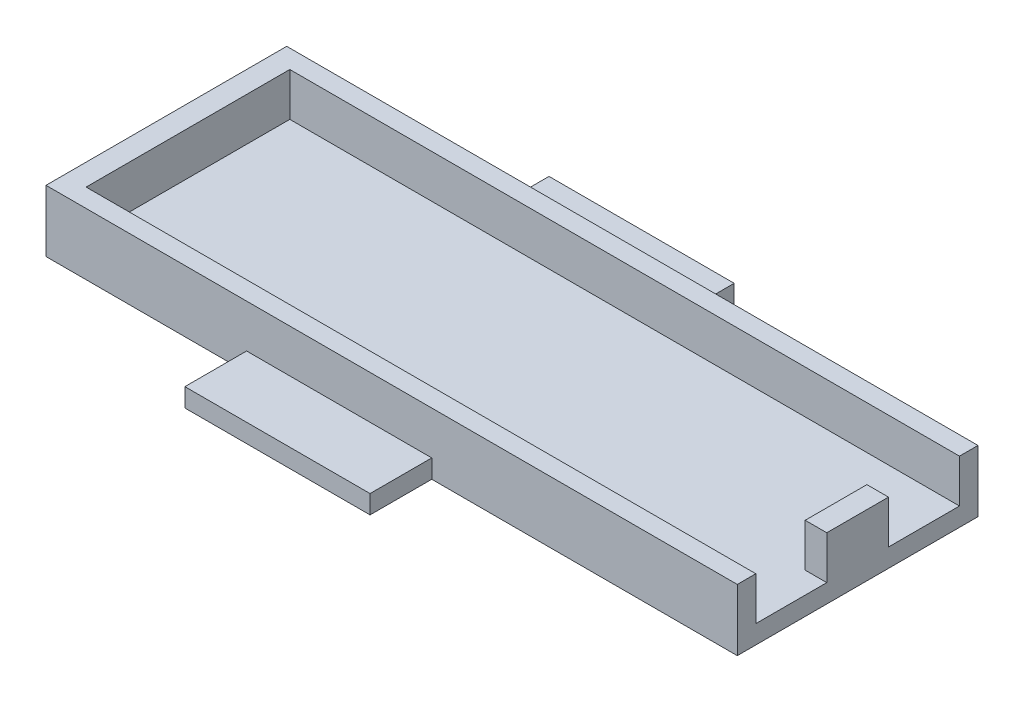
ISO-10303-21;
HEADER;
FILE_DESCRIPTION(('STEP AP214'),'2;1');
FILE_NAME('part.step','',(''),(''),'','','');
FILE_SCHEMA(('AUTOMOTIVE_DESIGN { 1 0 10303 214 1 1 1 1 }'));
ENDSEC;
DATA;
#1=APPLICATION_CONTEXT('core data for automotive mechanical design processes');
#2=APPLICATION_PROTOCOL_DEFINITION('international standard','automotive_design',2000,#1);
#3=PRODUCT_CONTEXT('',#1,'mechanical');
#4=PRODUCT('Part','Part','',(#3));
#5=PRODUCT_RELATED_PRODUCT_CATEGORY('part','',(#4));
#6=PRODUCT_DEFINITION_FORMATION('','',#4);
#7=PRODUCT_DEFINITION_CONTEXT('part definition',#1,'design');
#8=PRODUCT_DEFINITION('design','',#6,#7);
#9=PRODUCT_DEFINITION_SHAPE('','',#8);
#10=(LENGTH_UNIT() NAMED_UNIT(*) SI_UNIT(.MILLI.,.METRE.));
#11=(NAMED_UNIT(*) PLANE_ANGLE_UNIT() SI_UNIT($,.RADIAN.));
#12=(NAMED_UNIT(*) SI_UNIT($,.STERADIAN.) SOLID_ANGLE_UNIT());
#13=UNCERTAINTY_MEASURE_WITH_UNIT(LENGTH_MEASURE(1.E-05),#10,'distance_accuracy_value','');
#14=(GEOMETRIC_REPRESENTATION_CONTEXT(3) GLOBAL_UNCERTAINTY_ASSIGNED_CONTEXT((#13)) GLOBAL_UNIT_ASSIGNED_CONTEXT((#10,
#11,#12)) REPRESENTATION_CONTEXT('',''));
#15=CARTESIAN_POINT('',(0.,0.,0.));
#16=DIRECTION('',(0.,0.,1.));
#17=DIRECTION('',(1.,0.,0.));
#18=AXIS2_PLACEMENT_3D('',#15,#16,#17);
#19=CARTESIAN_POINT('',(0.,0.,0.));
#20=DIRECTION('',(0.,-1.,0.));
#21=DIRECTION('',(0.,0.,-1.));
#22=AXIS2_PLACEMENT_3D('',#19,#20,#21);
#23=PLANE('',#22);
#24=DIRECTION('',(0.,0.,-1.));
#25=VECTOR('',#24,1.);
#26=CARTESIAN_POINT('',(56.,0.,19.5));
#27=LINE('',#26,#25);
#28=CARTESIAN_POINT('',(56.,0.,19.5));
#29=VERTEX_POINT('',#28);
#30=CARTESIAN_POINT('',(56.,0.,-19.5));
#31=VERTEX_POINT('',#30);
#32=EDGE_CURVE('E391',#29,#31,#27,.T.);
#33=ORIENTED_EDGE('',*,*,#32,.F.);
#34=DIRECTION('',(1.,0.,0.));
#35=VECTOR('',#34,1.);
#36=CARTESIAN_POINT('',(-56.,0.,19.5));
#37=LINE('',#36,#35);
#38=CARTESIAN_POINT('',(6.50000000000002,0.,19.5));
#39=VERTEX_POINT('',#38);
#40=EDGE_CURVE('E412',#39,#29,#37,.T.);
#41=ORIENTED_EDGE('',*,*,#40,.F.);
#42=DIRECTION('',(0.,0.,-1.));
#43=VECTOR('',#42,1.);
#44=CARTESIAN_POINT('',(6.50000000000002,0.,19.5));
#45=LINE('',#44,#43);
#46=CARTESIAN_POINT('',(6.50000000000002,0.,29.5));
#47=VERTEX_POINT('',#46);
#48=EDGE_CURVE('E292',#47,#39,#45,.T.);
#49=ORIENTED_EDGE('',*,*,#48,.F.);
#50=DIRECTION('',(1.,0.,0.));
#51=VECTOR('',#50,1.);
#52=CARTESIAN_POINT('',(-23.5,0.,29.5));
#53=LINE('',#52,#51);
#54=CARTESIAN_POINT('',(-23.5,0.,29.5));
#55=VERTEX_POINT('',#54);
#56=EDGE_CURVE('E301',#55,#47,#53,.T.);
#57=ORIENTED_EDGE('',*,*,#56,.F.);
#58=DIRECTION('',(0.,0.,1.));
#59=VECTOR('',#58,1.);
#60=CARTESIAN_POINT('',(-23.5,0.,19.5));
#61=LINE('',#60,#59);
#62=CARTESIAN_POINT('',(-23.5,0.,19.5));
#63=VERTEX_POINT('',#62);
#64=EDGE_CURVE('E287',#63,#55,#61,.T.);
#65=ORIENTED_EDGE('',*,*,#64,.F.);
#66=CARTESIAN_POINT('',(-56.,0.,19.5));
#67=VERTEX_POINT('',#66);
#68=EDGE_CURVE('E413',#67,#63,#37,.T.);
#69=ORIENTED_EDGE('',*,*,#68,.F.);
#70=DIRECTION('',(0.,0.,1.));
#71=VECTOR('',#70,1.);
#72=CARTESIAN_POINT('',(-56.,0.,19.5));
#73=LINE('',#72,#71);
#74=CARTESIAN_POINT('',(-56.,0.,-19.5));
#75=VERTEX_POINT('',#74);
#76=EDGE_CURVE('E410',#75,#67,#73,.T.);
#77=ORIENTED_EDGE('',*,*,#76,.F.);
#78=DIRECTION('',(-1.,0.,0.));
#79=VECTOR('',#78,1.);
#80=CARTESIAN_POINT('',(-56.,0.,-19.5));
#81=LINE('',#80,#79);
#82=CARTESIAN_POINT('',(-23.5,0.,-19.5));
#83=VERTEX_POINT('',#82);
#84=EDGE_CURVE('E406',#83,#75,#81,.T.);
#85=ORIENTED_EDGE('',*,*,#84,.F.);
#86=DIRECTION('',(0.,0.,1.));
#87=VECTOR('',#86,1.);
#88=CARTESIAN_POINT('',(-23.5,0.,-19.5));
#89=LINE('',#88,#87);
#90=CARTESIAN_POINT('',(-23.5,0.,-29.5));
#91=VERTEX_POINT('',#90);
#92=EDGE_CURVE('E314',#91,#83,#89,.T.);
#93=ORIENTED_EDGE('',*,*,#92,.F.);
#94=DIRECTION('',(-1.,0.,0.));
#95=VECTOR('',#94,1.);
#96=CARTESIAN_POINT('',(-23.5,0.,-29.5));
#97=LINE('',#96,#95);
#98=CARTESIAN_POINT('',(6.50000000000002,0.,-29.5));
#99=VERTEX_POINT('',#98);
#100=EDGE_CURVE('E318',#99,#91,#97,.T.);
#101=ORIENTED_EDGE('',*,*,#100,.F.);
#102=DIRECTION('',(0.,0.,-1.));
#103=VECTOR('',#102,1.);
#104=CARTESIAN_POINT('',(6.50000000000002,0.,-19.5));
#105=LINE('',#104,#103);
#106=CARTESIAN_POINT('',(6.50000000000002,0.,-19.5));
#107=VERTEX_POINT('',#106);
#108=EDGE_CURVE('E326',#107,#99,#105,.T.);
#109=ORIENTED_EDGE('',*,*,#108,.F.);
#110=EDGE_CURVE('E407',#31,#107,#81,.T.);
#111=ORIENTED_EDGE('',*,*,#110,.F.);
#112=EDGE_LOOP('',(#33,#41,#49,#57,#65,#69,#77,#85,#93,#101,#109,#111));
#113=FACE_BOUND('',#112,.T.);
#114=CARTESIAN_POINT('',(0.500000000000028,0.,24.8459158911293));
#115=DIRECTION('',(0.,-1.,0.));
#116=DIRECTION('',(0.,0.,-1.));
#117=AXIS2_PLACEMENT_3D('',#114,#115,#116);
#118=CIRCLE('',#117,1.5);
#119=CARTESIAN_POINT('',(0.500000000000028,0.,26.3459158911293));
#120=VERTEX_POINT('',#119);
#121=CARTESIAN_POINT('',(0.500000000000028,0.,23.3459158911293));
#122=VERTEX_POINT('',#121);
#123=EDGE_CURVE('E274',#120,#122,#118,.F.);
#124=ORIENTED_EDGE('',*,*,#123,.T.);
#125=DIRECTION('',(1.,0.,0.));
#126=VECTOR('',#125,1.);
#127=CARTESIAN_POINT('',(0.,0.,23.3459158911293));
#128=LINE('',#127,#126);
#129=CARTESIAN_POINT('',(-16.5,0.,23.3459158911293));
#130=VERTEX_POINT('',#129);
#131=EDGE_CURVE('E232',#130,#122,#128,.T.);
#132=ORIENTED_EDGE('',*,*,#131,.F.);
#133=CARTESIAN_POINT('',(-16.5,0.,24.8459158911293));
#134=DIRECTION('',(0.,-1.,0.));
#135=DIRECTION('',(0.,0.,-1.));
#136=AXIS2_PLACEMENT_3D('',#133,#134,#135);
#137=CIRCLE('',#136,1.5);
#138=CARTESIAN_POINT('',(-16.5,0.,26.3459158911293));
#139=VERTEX_POINT('',#138);
#140=EDGE_CURVE('E263',#139,#130,#137,.T.);
#141=ORIENTED_EDGE('',*,*,#140,.F.);
#142=DIRECTION('',(1.,0.,0.));
#143=VECTOR('',#142,1.);
#144=CARTESIAN_POINT('',(0.,0.,26.3459158911293));
#145=LINE('',#144,#143);
#146=EDGE_CURVE('E58',#139,#120,#145,.T.);
#147=ORIENTED_EDGE('',*,*,#146,.T.);
#148=EDGE_LOOP('',(#124,#132,#141,#147));
#149=FACE_BOUND('',#148,.T.);
#150=DIRECTION('',(1.,0.,0.));
#151=VECTOR('',#150,1.);
#152=CARTESIAN_POINT('',(0.,0.,-23.3459158911293));
#153=LINE('',#152,#151);
#154=CARTESIAN_POINT('',(-16.5,0.,-23.3459158911293));
#155=VERTEX_POINT('',#154);
#156=CARTESIAN_POINT('',(0.500000000000028,0.,-23.3459158911293));
#157=VERTEX_POINT('',#156);
#158=EDGE_CURVE('E227',#155,#157,#153,.T.);
#159=ORIENTED_EDGE('',*,*,#158,.T.);
#160=CARTESIAN_POINT('',(0.500000000000028,0.,-24.8459158911293));
#161=DIRECTION('',(0.,1.,0.));
#162=DIRECTION('',(0.,0.,1.));
#163=AXIS2_PLACEMENT_3D('',#160,#161,#162);
#164=CIRCLE('',#163,1.5);
#165=CARTESIAN_POINT('',(0.500000000000028,0.,-26.3459158911293));
#166=VERTEX_POINT('',#165);
#167=EDGE_CURVE('E241',#166,#157,#164,.F.);
#168=ORIENTED_EDGE('',*,*,#167,.F.);
#169=DIRECTION('',(1.,0.,0.));
#170=VECTOR('',#169,1.);
#171=CARTESIAN_POINT('',(0.,0.,-26.3459158911293));
#172=LINE('',#171,#170);
#173=CARTESIAN_POINT('',(-16.5,0.,-26.3459158911293));
#174=VERTEX_POINT('',#173);
#175=EDGE_CURVE('E254',#174,#166,#172,.T.);
#176=ORIENTED_EDGE('',*,*,#175,.F.);
#177=CARTESIAN_POINT('',(-16.5,0.,-24.8459158911293));
#178=DIRECTION('',(0.,1.,0.));
#179=DIRECTION('',(0.,0.,1.));
#180=AXIS2_PLACEMENT_3D('',#177,#178,#179);
#181=CIRCLE('',#180,1.5);
#182=EDGE_CURVE('E252',#174,#155,#181,.T.);
#183=ORIENTED_EDGE('',*,*,#182,.T.);
#184=EDGE_LOOP('',(#159,#168,#176,#183));
#185=FACE_BOUND('',#184,.T.);
#186=ADVANCED_FACE('F35',(#113,#149,#185),#23,.T.);
#187=CARTESIAN_POINT('',(-56.,10.,19.5));
#188=DIRECTION('',(0.,0.,-1.));
#189=DIRECTION('',(-1.,0.,0.));
#190=AXIS2_PLACEMENT_3D('',#187,#188,#189);
#191=PLANE('',#190);
#192=DIRECTION('',(0.,-1.,0.));
#193=VECTOR('',#192,1.);
#194=CARTESIAN_POINT('',(-23.5,3.,19.5));
#195=LINE('',#194,#193);
#196=CARTESIAN_POINT('',(-23.5,3.,19.5));
#197=VERTEX_POINT('',#196);
#198=EDGE_CURVE('E298',#197,#63,#195,.T.);
#199=ORIENTED_EDGE('',*,*,#198,.F.);
#200=DIRECTION('',(-1.,0.,0.));
#201=VECTOR('',#200,1.);
#202=CARTESIAN_POINT('',(-23.5,3.,19.5));
#203=LINE('',#202,#201);
#204=CARTESIAN_POINT('',(6.50000000000002,3.,19.5));
#205=VERTEX_POINT('',#204);
#206=EDGE_CURVE('E296',#205,#197,#203,.T.);
#207=ORIENTED_EDGE('',*,*,#206,.F.);
#208=DIRECTION('',(0.,-1.,0.));
#209=VECTOR('',#208,1.);
#210=CARTESIAN_POINT('',(6.50000000000002,3.,19.5));
#211=LINE('',#210,#209);
#212=EDGE_CURVE('E305',#205,#39,#211,.T.);
#213=ORIENTED_EDGE('',*,*,#212,.T.);
#214=ORIENTED_EDGE('',*,*,#40,.T.);
#215=DIRECTION('',(0.,-1.,0.));
#216=VECTOR('',#215,1.);
#217=CARTESIAN_POINT('',(56.,10.,19.5));
#218=LINE('',#217,#216);
#219=CARTESIAN_POINT('',(56.,10.,19.5));
#220=VERTEX_POINT('',#219);
#221=EDGE_CURVE('E403',#220,#29,#218,.T.);
#222=ORIENTED_EDGE('',*,*,#221,.F.);
#223=DIRECTION('',(1.,0.,0.));
#224=VECTOR('',#223,1.);
#225=CARTESIAN_POINT('',(-56.,10.,19.5));
#226=LINE('',#225,#224);
#227=CARTESIAN_POINT('',(-56.,10.,19.5));
#228=VERTEX_POINT('',#227);
#229=EDGE_CURVE('E401',#228,#220,#226,.T.);
#230=ORIENTED_EDGE('',*,*,#229,.F.);
#231=DIRECTION('',(0.,-1.,0.));
#232=VECTOR('',#231,1.);
#233=CARTESIAN_POINT('',(-56.,10.,19.5));
#234=LINE('',#233,#232);
#235=EDGE_CURVE('E418',#228,#67,#234,.T.);
#236=ORIENTED_EDGE('',*,*,#235,.T.);
#237=ORIENTED_EDGE('',*,*,#68,.T.);
#238=EDGE_LOOP('',(#199,#207,#213,#214,#222,#230,#236,#237));
#239=FACE_BOUND('',#238,.T.);
#240=ADVANCED_FACE('F462',(#239),#191,.F.);
#241=CARTESIAN_POINT('',(-56.,10.,-19.5));
#242=DIRECTION('',(0.,0.,1.));
#243=DIRECTION('',(1.,0.,0.));
#244=AXIS2_PLACEMENT_3D('',#241,#242,#243);
#245=PLANE('',#244);
#246=DIRECTION('',(0.,-1.,0.));
#247=VECTOR('',#246,1.);
#248=CARTESIAN_POINT('',(6.50000000000002,3.,-19.5));
#249=LINE('',#248,#247);
#250=CARTESIAN_POINT('',(6.50000000000002,3.,-19.5));
#251=VERTEX_POINT('',#250);
#252=EDGE_CURVE('E334',#251,#107,#249,.T.);
#253=ORIENTED_EDGE('',*,*,#252,.F.);
#254=DIRECTION('',(1.,0.,0.));
#255=VECTOR('',#254,1.);
#256=CARTESIAN_POINT('',(-23.5,3.,-19.5));
#257=LINE('',#256,#255);
#258=CARTESIAN_POINT('',(-23.5,3.,-19.5));
#259=VERTEX_POINT('',#258);
#260=EDGE_CURVE('E317',#259,#251,#257,.T.);
#261=ORIENTED_EDGE('',*,*,#260,.F.);
#262=DIRECTION('',(0.,-1.,0.));
#263=VECTOR('',#262,1.);
#264=CARTESIAN_POINT('',(-23.5,3.,-19.5));
#265=LINE('',#264,#263);
#266=EDGE_CURVE('E336',#259,#83,#265,.T.);
#267=ORIENTED_EDGE('',*,*,#266,.T.);
#268=ORIENTED_EDGE('',*,*,#84,.T.);
#269=DIRECTION('',(0.,-1.,0.));
#270=VECTOR('',#269,1.);
#271=CARTESIAN_POINT('',(-56.,10.,-19.5));
#272=LINE('',#271,#270);
#273=CARTESIAN_POINT('',(-56.,10.,-19.5));
#274=VERTEX_POINT('',#273);
#275=EDGE_CURVE('E421',#274,#75,#272,.T.);
#276=ORIENTED_EDGE('',*,*,#275,.F.);
#277=DIRECTION('',(-1.,0.,0.));
#278=VECTOR('',#277,1.);
#279=CARTESIAN_POINT('',(-56.,10.,-19.5));
#280=LINE('',#279,#278);
#281=CARTESIAN_POINT('',(56.,10.,-19.5));
#282=VERTEX_POINT('',#281);
#283=EDGE_CURVE('E395',#282,#274,#280,.T.);
#284=ORIENTED_EDGE('',*,*,#283,.F.);
#285=DIRECTION('',(0.,-1.,0.));
#286=VECTOR('',#285,1.);
#287=CARTESIAN_POINT('',(56.,10.,-19.5));
#288=LINE('',#287,#286);
#289=EDGE_CURVE('E424',#282,#31,#288,.T.);
#290=ORIENTED_EDGE('',*,*,#289,.T.);
#291=ORIENTED_EDGE('',*,*,#110,.T.);
#292=EDGE_LOOP('',(#253,#261,#267,#268,#276,#284,#290,#291));
#293=FACE_BOUND('',#292,.T.);
#294=ADVANCED_FACE('F474',(#293),#245,.F.);
#295=CARTESIAN_POINT('',(0.,10.,0.));
#296=DIRECTION('',(0.,-1.,0.));
#297=DIRECTION('',(0.,0.,-1.));
#298=AXIS2_PLACEMENT_3D('',#295,#296,#297);
#299=PLANE('',#298);
#300=DIRECTION('',(-1.,0.,0.));
#301=VECTOR('',#300,1.);
#302=CARTESIAN_POINT('',(-52.5,10.,-16.5));
#303=LINE('',#302,#301);
#304=CARTESIAN_POINT('',(56.,10.,-16.5));
#305=VERTEX_POINT('',#304);
#306=CARTESIAN_POINT('',(-52.5,10.,-16.5));
#307=VERTEX_POINT('',#306);
#308=EDGE_CURVE('E378',#305,#307,#303,.T.);
#309=ORIENTED_EDGE('',*,*,#308,.F.);
#310=DIRECTION('',(0.,0.,-1.));
#311=VECTOR('',#310,1.);
#312=CARTESIAN_POINT('',(56.,10.,19.5));
#313=LINE('',#312,#311);
#314=EDGE_CURVE('E397',#305,#282,#313,.T.);
#315=ORIENTED_EDGE('',*,*,#314,.T.);
#316=ORIENTED_EDGE('',*,*,#283,.T.);
#317=DIRECTION('',(0.,0.,1.));
#318=VECTOR('',#317,1.);
#319=CARTESIAN_POINT('',(-56.,10.,19.5));
#320=LINE('',#319,#318);
#321=EDGE_CURVE('E399',#274,#228,#320,.T.);
#322=ORIENTED_EDGE('',*,*,#321,.T.);
#323=ORIENTED_EDGE('',*,*,#229,.T.);
#324=CARTESIAN_POINT('',(56.,10.,16.5));
#325=VERTEX_POINT('',#324);
#326=EDGE_CURVE('E392',#220,#325,#313,.T.);
#327=ORIENTED_EDGE('',*,*,#326,.T.);
#328=DIRECTION('',(1.,0.,0.));
#329=VECTOR('',#328,1.);
#330=CARTESIAN_POINT('',(-52.5,10.,16.5));
#331=LINE('',#330,#329);
#332=CARTESIAN_POINT('',(-52.5,10.,16.5));
#333=VERTEX_POINT('',#332);
#334=EDGE_CURVE('E383',#333,#325,#331,.T.);
#335=ORIENTED_EDGE('',*,*,#334,.F.);
#336=DIRECTION('',(0.,0.,1.));
#337=VECTOR('',#336,1.);
#338=CARTESIAN_POINT('',(-52.5,10.,16.5));
#339=LINE('',#338,#337);
#340=EDGE_CURVE('E380',#307,#333,#339,.T.);
#341=ORIENTED_EDGE('',*,*,#340,.F.);
#342=EDGE_LOOP('',(#309,#315,#316,#322,#323,#327,#335,#341));
#343=FACE_BOUND('',#342,.T.);
#344=ADVANCED_FACE('F454',(#343),#299,.F.);
#345=CARTESIAN_POINT('',(52.5,10.,16.5));
#346=DIRECTION('',(-1.,0.,0.));
#347=DIRECTION('',(0.,0.,1.));
#348=AXIS2_PLACEMENT_3D('',#345,#346,#347);
#349=PLANE('',#348);
#350=DIRECTION('',(0.,1.,0.));
#351=VECTOR('',#350,1.);
#352=CARTESIAN_POINT('',(52.5,13.9191974963196,-5.));
#353=LINE('',#352,#351);
#354=CARTESIAN_POINT('',(52.5,3.,-5.));
#355=VERTEX_POINT('',#354);
#356=CARTESIAN_POINT('',(52.5,10.,-5.));
#357=VERTEX_POINT('',#356);
#358=EDGE_CURVE('E344',#355,#357,#353,.T.);
#359=ORIENTED_EDGE('',*,*,#358,.F.);
#360=DIRECTION('',(0.,0.,-1.));
#361=VECTOR('',#360,1.);
#362=CARTESIAN_POINT('',(52.5,3.,16.5));
#363=LINE('',#362,#361);
#364=CARTESIAN_POINT('',(52.5,3.,5.));
#365=VERTEX_POINT('',#364);
#366=EDGE_CURVE('E366',#365,#355,#363,.T.);
#367=ORIENTED_EDGE('',*,*,#366,.F.);
#368=DIRECTION('',(0.,-1.,0.));
#369=VECTOR('',#368,1.);
#370=CARTESIAN_POINT('',(52.5,14.0512845628074,5.));
#371=LINE('',#370,#369);
#372=CARTESIAN_POINT('',(52.5,10.,5.));
#373=VERTEX_POINT('',#372);
#374=EDGE_CURVE('E339',#373,#365,#371,.T.);
#375=ORIENTED_EDGE('',*,*,#374,.F.);
#376=DIRECTION('',(0.,0.,-1.));
#377=VECTOR('',#376,1.);
#378=CARTESIAN_POINT('',(52.5,10.,16.5));
#379=LINE('',#378,#377);
#380=EDGE_CURVE('E375',#373,#357,#379,.T.);
#381=ORIENTED_EDGE('',*,*,#380,.T.);
#382=EDGE_LOOP('',(#359,#367,#375,#381));
#383=FACE_BOUND('',#382,.T.);
#384=ADVANCED_FACE('F440',(#383),#349,.T.);
#385=CARTESIAN_POINT('',(-52.5,10.,-16.5));
#386=DIRECTION('',(0.,0.,1.));
#387=DIRECTION('',(1.,0.,0.));
#388=AXIS2_PLACEMENT_3D('',#385,#386,#387);
#389=PLANE('',#388);
#390=DIRECTION('',(0.,-1.,0.));
#391=VECTOR('',#390,1.);
#392=CARTESIAN_POINT('',(-52.5,10.,-16.5));
#393=LINE('',#392,#391);
#394=CARTESIAN_POINT('',(-52.5,3.,-16.5));
#395=VERTEX_POINT('',#394);
#396=EDGE_CURVE('E388',#307,#395,#393,.T.);
#397=ORIENTED_EDGE('',*,*,#396,.T.);
#398=DIRECTION('',(-1.,0.,0.));
#399=VECTOR('',#398,1.);
#400=CARTESIAN_POINT('',(-52.5,3.,-16.5));
#401=LINE('',#400,#399);
#402=CARTESIAN_POINT('',(56.,3.,-16.5));
#403=VERTEX_POINT('',#402);
#404=EDGE_CURVE('E369',#403,#395,#401,.T.);
#405=ORIENTED_EDGE('',*,*,#404,.F.);
#406=DIRECTION('',(0.,-1.,0.));
#407=VECTOR('',#406,1.);
#408=CARTESIAN_POINT('',(56.,10.,-16.5));
#409=LINE('',#408,#407);
#410=EDGE_CURVE('E11',#305,#403,#409,.T.);
#411=ORIENTED_EDGE('',*,*,#410,.F.);
#412=ORIENTED_EDGE('',*,*,#308,.T.);
#413=EDGE_LOOP('',(#397,#405,#411,#412));
#414=FACE_BOUND('',#413,.T.);
#415=ADVANCED_FACE('F479',(#414),#389,.T.);
#416=CARTESIAN_POINT('',(-52.5,10.,16.5));
#417=DIRECTION('',(1.,0.,0.));
#418=DIRECTION('',(0.,0.,-1.));
#419=AXIS2_PLACEMENT_3D('',#416,#417,#418);
#420=PLANE('',#419);
#421=DIRECTION('',(0.,-1.,0.));
#422=VECTOR('',#421,1.);
#423=CARTESIAN_POINT('',(-52.5,10.,16.5));
#424=LINE('',#423,#422);
#425=CARTESIAN_POINT('',(-52.5,3.,16.5));
#426=VERTEX_POINT('',#425);
#427=EDGE_CURVE('E385',#333,#426,#424,.T.);
#428=ORIENTED_EDGE('',*,*,#427,.T.);
#429=DIRECTION('',(0.,0.,1.));
#430=VECTOR('',#429,1.);
#431=CARTESIAN_POINT('',(-52.5,3.,16.5));
#432=LINE('',#431,#430);
#433=EDGE_CURVE('E371',#395,#426,#432,.T.);
#434=ORIENTED_EDGE('',*,*,#433,.F.);
#435=ORIENTED_EDGE('',*,*,#396,.F.);
#436=ORIENTED_EDGE('',*,*,#340,.T.);
#437=EDGE_LOOP('',(#428,#434,#435,#436));
#438=FACE_BOUND('',#437,.T.);
#439=ADVANCED_FACE('F517',(#438),#420,.T.);
#440=CARTESIAN_POINT('',(-52.5,10.,16.5));
#441=DIRECTION('',(0.,0.,-1.));
#442=DIRECTION('',(-1.,0.,0.));
#443=AXIS2_PLACEMENT_3D('',#440,#441,#442);
#444=PLANE('',#443);
#445=ORIENTED_EDGE('',*,*,#334,.T.);
#446=DIRECTION('',(0.,1.,0.));
#447=VECTOR('',#446,1.);
#448=CARTESIAN_POINT('',(56.,14.0512845628074,16.5));
#449=LINE('',#448,#447);
#450=CARTESIAN_POINT('',(56.,3.,16.5));
#451=VERTEX_POINT('',#450);
#452=EDGE_CURVE('E355',#451,#325,#449,.T.);
#453=ORIENTED_EDGE('',*,*,#452,.F.);
#454=DIRECTION('',(1.,0.,0.));
#455=VECTOR('',#454,1.);
#456=CARTESIAN_POINT('',(-52.5,3.,16.5));
#457=LINE('',#456,#455);
#458=EDGE_CURVE('E373',#426,#451,#457,.T.);
#459=ORIENTED_EDGE('',*,*,#458,.F.);
#460=ORIENTED_EDGE('',*,*,#427,.F.);
#461=EDGE_LOOP('',(#445,#453,#459,#460));
#462=FACE_BOUND('',#461,.T.);
#463=ADVANCED_FACE('F450',(#462),#444,.T.);
#464=CARTESIAN_POINT('',(56.,10.,5.));
#465=VERTEX_POINT('',#464);
#466=CARTESIAN_POINT('',(56.,10.,-5.));
#467=VERTEX_POINT('',#466);
#468=EDGE_CURVE('E396',#465,#467,#313,.T.);
#469=ORIENTED_EDGE('',*,*,#468,.T.);
#470=DIRECTION('',(-1.,0.,0.));
#471=VECTOR('',#470,1.);
#472=CARTESIAN_POINT('',(0.,10.,-5.));
#473=LINE('',#472,#471);
#474=EDGE_CURVE('E363',#467,#357,#473,.T.);
#475=ORIENTED_EDGE('',*,*,#474,.T.);
#476=ORIENTED_EDGE('',*,*,#380,.F.);
#477=DIRECTION('',(1.,0.,0.));
#478=VECTOR('',#477,1.);
#479=CARTESIAN_POINT('',(0.,10.,5.));
#480=LINE('',#479,#478);
#481=EDGE_CURVE('E351',#373,#465,#480,.T.);
#482=ORIENTED_EDGE('',*,*,#481,.T.);
#483=EDGE_LOOP('',(#469,#475,#476,#482));
#484=FACE_BOUND('',#483,.T.);
#485=ADVANCED_FACE('F437',(#484),#299,.F.);
#486=CARTESIAN_POINT('',(56.,10.,19.5));
#487=DIRECTION('',(-1.,0.,0.));
#488=DIRECTION('',(0.,0.,1.));
#489=AXIS2_PLACEMENT_3D('',#486,#487,#488);
#490=PLANE('',#489);
#491=ORIENTED_EDGE('',*,*,#314,.F.);
#492=ORIENTED_EDGE('',*,*,#410,.T.);
#493=DIRECTION('',(0.,0.,1.));
#494=VECTOR('',#493,1.);
#495=CARTESIAN_POINT('',(56.,3.,-16.5));
#496=LINE('',#495,#494);
#497=CARTESIAN_POINT('',(56.,3.,-5.));
#498=VERTEX_POINT('',#497);
#499=EDGE_CURVE('E340',#403,#498,#496,.T.);
#500=ORIENTED_EDGE('',*,*,#499,.T.);
#501=DIRECTION('',(0.,1.,0.));
#502=VECTOR('',#501,1.);
#503=CARTESIAN_POINT('',(56.,13.9191974963196,-5.));
#504=LINE('',#503,#502);
#505=EDGE_CURVE('E343',#498,#467,#504,.T.);
#506=ORIENTED_EDGE('',*,*,#505,.T.);
#507=ORIENTED_EDGE('',*,*,#468,.F.);
#508=DIRECTION('',(0.,-1.,0.));
#509=VECTOR('',#508,1.);
#510=CARTESIAN_POINT('',(56.,10.,5.));
#511=LINE('',#510,#509);
#512=CARTESIAN_POINT('',(56.,3.,5.));
#513=VERTEX_POINT('',#512);
#514=EDGE_CURVE('E43',#465,#513,#511,.T.);
#515=ORIENTED_EDGE('',*,*,#514,.T.);
#516=DIRECTION('',(0.,0.,1.));
#517=VECTOR('',#516,1.);
#518=CARTESIAN_POINT('',(56.,3.,5.));
#519=LINE('',#518,#517);
#520=EDGE_CURVE('E352',#513,#451,#519,.T.);
#521=ORIENTED_EDGE('',*,*,#520,.T.);
#522=ORIENTED_EDGE('',*,*,#452,.T.);
#523=ORIENTED_EDGE('',*,*,#326,.F.);
#524=ORIENTED_EDGE('',*,*,#221,.T.);
#525=ORIENTED_EDGE('',*,*,#32,.T.);
#526=ORIENTED_EDGE('',*,*,#289,.F.);
#527=EDGE_LOOP('',(#491,#492,#500,#506,#507,#515,#521,#522,#523,#524,#525,#526));
#528=FACE_BOUND('',#527,.T.);
#529=ADVANCED_FACE('F37',(#528),#490,.F.);
#530=CARTESIAN_POINT('',(-56.,10.,19.5));
#531=DIRECTION('',(1.,0.,0.));
#532=DIRECTION('',(0.,0.,-1.));
#533=AXIS2_PLACEMENT_3D('',#530,#531,#532);
#534=PLANE('',#533);
#535=ORIENTED_EDGE('',*,*,#76,.T.);
#536=ORIENTED_EDGE('',*,*,#235,.F.);
#537=ORIENTED_EDGE('',*,*,#321,.F.);
#538=ORIENTED_EDGE('',*,*,#275,.T.);
#539=EDGE_LOOP('',(#535,#536,#537,#538));
#540=FACE_BOUND('',#539,.T.);
#541=ADVANCED_FACE('F502',(#540),#534,.F.);
#542=CARTESIAN_POINT('',(0.,3.,0.));
#543=DIRECTION('',(0.,-1.,0.));
#544=DIRECTION('',(0.,0.,-1.));
#545=AXIS2_PLACEMENT_3D('',#542,#543,#544);
#546=PLANE('',#545);
#547=ORIENTED_EDGE('',*,*,#458,.T.);
#548=ORIENTED_EDGE('',*,*,#520,.F.);
#549=DIRECTION('',(-1.,0.,0.));
#550=VECTOR('',#549,1.);
#551=CARTESIAN_POINT('',(56.,3.,5.));
#552=LINE('',#551,#550);
#553=EDGE_CURVE('E349',#513,#365,#552,.T.);
#554=ORIENTED_EDGE('',*,*,#553,.T.);
#555=ORIENTED_EDGE('',*,*,#366,.T.);
#556=DIRECTION('',(-1.,0.,0.));
#557=VECTOR('',#556,1.);
#558=CARTESIAN_POINT('',(56.,3.,-5.));
#559=LINE('',#558,#557);
#560=EDGE_CURVE('E347',#498,#355,#559,.T.);
#561=ORIENTED_EDGE('',*,*,#560,.F.);
#562=ORIENTED_EDGE('',*,*,#499,.F.);
#563=ORIENTED_EDGE('',*,*,#404,.T.);
#564=ORIENTED_EDGE('',*,*,#433,.T.);
#565=EDGE_LOOP('',(#547,#548,#554,#555,#561,#562,#563,#564));
#566=FACE_BOUND('',#565,.T.);
#567=ADVANCED_FACE('F443',(#566),#546,.F.);
#568=CARTESIAN_POINT('',(56.,14.0512845628074,5.));
#569=DIRECTION('',(0.,0.,-1.));
#570=DIRECTION('',(0.,1.,0.));
#571=AXIS2_PLACEMENT_3D('',#568,#569,#570);
#572=PLANE('',#571);
#573=ORIENTED_EDGE('',*,*,#374,.T.);
#574=ORIENTED_EDGE('',*,*,#553,.F.);
#575=ORIENTED_EDGE('',*,*,#514,.F.);
#576=ORIENTED_EDGE('',*,*,#481,.F.);
#577=EDGE_LOOP('',(#573,#574,#575,#576));
#578=FACE_BOUND('',#577,.T.);
#579=ADVANCED_FACE('F433',(#578),#572,.F.);
#580=CARTESIAN_POINT('',(56.,13.9191974963196,-5.));
#581=DIRECTION('',(0.,0.,1.));
#582=DIRECTION('',(0.,-1.,0.));
#583=AXIS2_PLACEMENT_3D('',#580,#581,#582);
#584=PLANE('',#583);
#585=ORIENTED_EDGE('',*,*,#505,.F.);
#586=ORIENTED_EDGE('',*,*,#560,.T.);
#587=ORIENTED_EDGE('',*,*,#358,.T.);
#588=ORIENTED_EDGE('',*,*,#474,.F.);
#589=EDGE_LOOP('',(#585,#586,#587,#588));
#590=FACE_BOUND('',#589,.T.);
#591=ADVANCED_FACE('F481',(#590),#584,.F.);
#592=CARTESIAN_POINT('',(-23.5,3.,-19.5));
#593=DIRECTION('',(1.,0.,0.));
#594=DIRECTION('',(0.,0.,-1.));
#595=AXIS2_PLACEMENT_3D('',#592,#593,#594);
#596=PLANE('',#595);
#597=ORIENTED_EDGE('',*,*,#92,.T.);
#598=ORIENTED_EDGE('',*,*,#266,.F.);
#599=DIRECTION('',(0.,0.,1.));
#600=VECTOR('',#599,1.);
#601=CARTESIAN_POINT('',(-23.5,3.,-19.5));
#602=LINE('',#601,#600);
#603=CARTESIAN_POINT('',(-23.5,3.,-29.5));
#604=VERTEX_POINT('',#603);
#605=EDGE_CURVE('E315',#604,#259,#602,.T.);
#606=ORIENTED_EDGE('',*,*,#605,.F.);
#607=DIRECTION('',(0.,-1.,0.));
#608=VECTOR('',#607,1.);
#609=CARTESIAN_POINT('',(-23.5,3.,-29.5));
#610=LINE('',#609,#608);
#611=EDGE_CURVE('E324',#604,#91,#610,.T.);
#612=ORIENTED_EDGE('',*,*,#611,.T.);
#613=EDGE_LOOP('',(#597,#598,#606,#612));
#614=FACE_BOUND('',#613,.T.);
#615=ADVANCED_FACE('F483',(#614),#596,.F.);
#616=CARTESIAN_POINT('',(6.50000000000002,3.,-19.5));
#617=DIRECTION('',(-1.,0.,0.));
#618=DIRECTION('',(0.,0.,1.));
#619=AXIS2_PLACEMENT_3D('',#616,#617,#618);
#620=PLANE('',#619);
#621=ORIENTED_EDGE('',*,*,#108,.T.);
#622=DIRECTION('',(0.,-1.,0.));
#623=VECTOR('',#622,1.);
#624=CARTESIAN_POINT('',(6.50000000000002,3.,-29.5));
#625=LINE('',#624,#623);
#626=CARTESIAN_POINT('',(6.50000000000002,3.,-29.5));
#627=VERTEX_POINT('',#626);
#628=EDGE_CURVE('E331',#627,#99,#625,.T.);
#629=ORIENTED_EDGE('',*,*,#628,.F.);
#630=DIRECTION('',(0.,0.,-1.));
#631=VECTOR('',#630,1.);
#632=CARTESIAN_POINT('',(6.50000000000002,3.,-19.5));
#633=LINE('',#632,#631);
#634=EDGE_CURVE('E320',#251,#627,#633,.T.);
#635=ORIENTED_EDGE('',*,*,#634,.F.);
#636=ORIENTED_EDGE('',*,*,#252,.T.);
#637=EDGE_LOOP('',(#621,#629,#635,#636));
#638=FACE_BOUND('',#637,.T.);
#639=ADVANCED_FACE('F489',(#638),#620,.F.);
#640=CARTESIAN_POINT('',(-23.5,3.,-29.5));
#641=DIRECTION('',(0.,0.,1.));
#642=DIRECTION('',(1.,0.,0.));
#643=AXIS2_PLACEMENT_3D('',#640,#641,#642);
#644=PLANE('',#643);
#645=ORIENTED_EDGE('',*,*,#100,.T.);
#646=ORIENTED_EDGE('',*,*,#611,.F.);
#647=DIRECTION('',(-1.,0.,0.));
#648=VECTOR('',#647,1.);
#649=CARTESIAN_POINT('',(-23.5,3.,-29.5));
#650=LINE('',#649,#648);
#651=EDGE_CURVE('E322',#627,#604,#650,.T.);
#652=ORIENTED_EDGE('',*,*,#651,.F.);
#653=ORIENTED_EDGE('',*,*,#628,.T.);
#654=EDGE_LOOP('',(#645,#646,#652,#653));
#655=FACE_BOUND('',#654,.T.);
#656=ADVANCED_FACE('F616',(#655),#644,.F.);
#657=CARTESIAN_POINT('',(0.,3.,0.));
#658=DIRECTION('',(0.,-1.,0.));
#659=DIRECTION('',(0.,0.,-1.));
#660=AXIS2_PLACEMENT_3D('',#657,#658,#659);
#661=PLANE('',#660);
#662=ORIENTED_EDGE('',*,*,#605,.T.);
#663=ORIENTED_EDGE('',*,*,#260,.T.);
#664=ORIENTED_EDGE('',*,*,#634,.T.);
#665=ORIENTED_EDGE('',*,*,#651,.T.);
#666=EDGE_LOOP('',(#662,#663,#664,#665));
#667=FACE_BOUND('',#666,.T.);
#668=ADVANCED_FACE('F626',(#667),#661,.F.);
#669=CARTESIAN_POINT('',(-23.5,3.,19.5));
#670=DIRECTION('',(1.,0.,0.));
#671=DIRECTION('',(0.,0.,-1.));
#672=AXIS2_PLACEMENT_3D('',#669,#670,#671);
#673=PLANE('',#672);
#674=ORIENTED_EDGE('',*,*,#64,.T.);
#675=DIRECTION('',(0.,-1.,0.));
#676=VECTOR('',#675,1.);
#677=CARTESIAN_POINT('',(-23.5,3.,29.5));
#678=LINE('',#677,#676);
#679=CARTESIAN_POINT('',(-23.5,3.,29.5));
#680=VERTEX_POINT('',#679);
#681=EDGE_CURVE('E311',#680,#55,#678,.T.);
#682=ORIENTED_EDGE('',*,*,#681,.F.);
#683=DIRECTION('',(0.,0.,1.));
#684=VECTOR('',#683,1.);
#685=CARTESIAN_POINT('',(-23.5,3.,19.5));
#686=LINE('',#685,#684);
#687=EDGE_CURVE('E288',#197,#680,#686,.T.);
#688=ORIENTED_EDGE('',*,*,#687,.F.);
#689=ORIENTED_EDGE('',*,*,#198,.T.);
#690=EDGE_LOOP('',(#674,#682,#688,#689));
#691=FACE_BOUND('',#690,.T.);
#692=ADVANCED_FACE('F636',(#691),#673,.F.);
#693=CARTESIAN_POINT('',(-23.5,3.,29.5));
#694=DIRECTION('',(0.,0.,-1.));
#695=DIRECTION('',(-1.,0.,0.));
#696=AXIS2_PLACEMENT_3D('',#693,#694,#695);
#697=PLANE('',#696);
#698=ORIENTED_EDGE('',*,*,#56,.T.);
#699=DIRECTION('',(0.,-1.,0.));
#700=VECTOR('',#699,1.);
#701=CARTESIAN_POINT('',(6.50000000000002,3.,29.5));
#702=LINE('',#701,#700);
#703=CARTESIAN_POINT('',(6.50000000000002,3.,29.5));
#704=VERTEX_POINT('',#703);
#705=EDGE_CURVE('E308',#704,#47,#702,.T.);
#706=ORIENTED_EDGE('',*,*,#705,.F.);
#707=DIRECTION('',(1.,0.,0.));
#708=VECTOR('',#707,1.);
#709=CARTESIAN_POINT('',(-23.5,3.,29.5));
#710=LINE('',#709,#708);
#711=EDGE_CURVE('E291',#680,#704,#710,.T.);
#712=ORIENTED_EDGE('',*,*,#711,.F.);
#713=ORIENTED_EDGE('',*,*,#681,.T.);
#714=EDGE_LOOP('',(#698,#706,#712,#713));
#715=FACE_BOUND('',#714,.T.);
#716=ADVANCED_FACE('F646',(#715),#697,.F.);
#717=CARTESIAN_POINT('',(6.50000000000002,3.,19.5));
#718=DIRECTION('',(-1.,0.,0.));
#719=DIRECTION('',(0.,0.,1.));
#720=AXIS2_PLACEMENT_3D('',#717,#718,#719);
#721=PLANE('',#720);
#722=ORIENTED_EDGE('',*,*,#48,.T.);
#723=ORIENTED_EDGE('',*,*,#212,.F.);
#724=DIRECTION('',(0.,0.,-1.));
#725=VECTOR('',#724,1.);
#726=CARTESIAN_POINT('',(6.50000000000002,3.,19.5));
#727=LINE('',#726,#725);
#728=EDGE_CURVE('E294',#704,#205,#727,.T.);
#729=ORIENTED_EDGE('',*,*,#728,.F.);
#730=ORIENTED_EDGE('',*,*,#705,.T.);
#731=EDGE_LOOP('',(#722,#723,#729,#730));
#732=FACE_BOUND('',#731,.T.);
#733=ADVANCED_FACE('F656',(#732),#721,.F.);
#734=CARTESIAN_POINT('',(0.,3.,0.));
#735=DIRECTION('',(0.,1.,0.));
#736=DIRECTION('',(0.,0.,1.));
#737=AXIS2_PLACEMENT_3D('',#734,#735,#736);
#738=PLANE('',#737);
#739=ORIENTED_EDGE('',*,*,#687,.T.);
#740=ORIENTED_EDGE('',*,*,#711,.T.);
#741=ORIENTED_EDGE('',*,*,#728,.T.);
#742=ORIENTED_EDGE('',*,*,#206,.T.);
#743=EDGE_LOOP('',(#739,#740,#741,#742));
#744=FACE_BOUND('',#743,.T.);
#745=ADVANCED_FACE('F666',(#744),#738,.T.);
#746=CARTESIAN_POINT('',(0.,-3.,23.3459158911293));
#747=DIRECTION('',(0.,0.,1.));
#748=DIRECTION('',(1.,0.,0.));
#749=AXIS2_PLACEMENT_3D('',#746,#747,#748);
#750=PLANE('',#749);
#751=ORIENTED_EDGE('',*,*,#131,.T.);
#752=DIRECTION('',(0.,1.,0.));
#753=VECTOR('',#752,1.);
#754=CARTESIAN_POINT('',(0.500000000000028,-3.,23.3459158911293));
#755=LINE('',#754,#753);
#756=CARTESIAN_POINT('',(0.500000000000028,-3.,23.3459158911293));
#757=VERTEX_POINT('',#756);
#758=EDGE_CURVE('E285',#757,#122,#755,.T.);
#759=ORIENTED_EDGE('',*,*,#758,.F.);
#760=DIRECTION('',(1.,0.,0.));
#761=VECTOR('',#760,1.);
#762=CARTESIAN_POINT('',(0.,-3.,23.3459158911293));
#763=LINE('',#762,#761);
#764=CARTESIAN_POINT('',(-16.5,-3.,23.3459158911293));
#765=VERTEX_POINT('',#764);
#766=EDGE_CURVE('E260',#765,#757,#763,.T.);
#767=ORIENTED_EDGE('',*,*,#766,.F.);
#768=DIRECTION('',(0.,1.,0.));
#769=VECTOR('',#768,1.);
#770=CARTESIAN_POINT('',(-16.5,-3.,23.3459158911293));
#771=LINE('',#770,#769);
#772=EDGE_CURVE('E271',#765,#130,#771,.T.);
#773=ORIENTED_EDGE('',*,*,#772,.T.);
#774=EDGE_LOOP('',(#751,#759,#767,#773));
#775=FACE_BOUND('',#774,.T.);
#776=ADVANCED_FACE('F676',(#775),#750,.F.);
#777=CARTESIAN_POINT('',(0.500000000000028,-3.,24.8459158911293));
#778=DIRECTION('',(0.,1.,0.));
#779=DIRECTION('',(0.,0.,1.));
#780=AXIS2_PLACEMENT_3D('',#777,#778,#779);
#781=CYLINDRICAL_SURFACE('',#780,1.5);
#782=ORIENTED_EDGE('',*,*,#123,.F.);
#783=DIRECTION('',(0.,1.,0.));
#784=VECTOR('',#783,1.);
#785=CARTESIAN_POINT('',(0.500000000000028,-3.,26.3459158911293));
#786=LINE('',#785,#784);
#787=CARTESIAN_POINT('',(0.500000000000028,-3.,26.3459158911293));
#788=VERTEX_POINT('',#787);
#789=EDGE_CURVE('E283',#788,#120,#786,.T.);
#790=ORIENTED_EDGE('',*,*,#789,.F.);
#791=CARTESIAN_POINT('',(0.500000000000028,-3.,24.8459158911293));
#792=DIRECTION('',(0.,-1.,0.));
#793=DIRECTION('',(0.,0.,-1.));
#794=AXIS2_PLACEMENT_3D('',#791,#792,#793);
#795=CIRCLE('',#794,1.5);
#796=EDGE_CURVE('E262',#788,#757,#795,.F.);
#797=ORIENTED_EDGE('',*,*,#796,.T.);
#798=ORIENTED_EDGE('',*,*,#758,.T.);
#799=EDGE_LOOP('',(#782,#790,#797,#798));
#800=FACE_BOUND('',#799,.T.);
#801=ADVANCED_FACE('F686',(#800),#781,.T.);
#802=CARTESIAN_POINT('',(0.,-3.,26.3459158911293));
#803=DIRECTION('',(0.,0.,1.));
#804=DIRECTION('',(1.,0.,0.));
#805=AXIS2_PLACEMENT_3D('',#802,#803,#804);
#806=PLANE('',#805);
#807=ORIENTED_EDGE('',*,*,#146,.F.);
#808=DIRECTION('',(0.,1.,0.));
#809=VECTOR('',#808,1.);
#810=CARTESIAN_POINT('',(-16.5,-3.,26.3459158911293));
#811=LINE('',#810,#809);
#812=CARTESIAN_POINT('',(-16.5,-3.,26.3459158911293));
#813=VERTEX_POINT('',#812);
#814=EDGE_CURVE('E281',#813,#139,#811,.T.);
#815=ORIENTED_EDGE('',*,*,#814,.F.);
#816=DIRECTION('',(1.,0.,0.));
#817=VECTOR('',#816,1.);
#818=CARTESIAN_POINT('',(0.,-3.,26.3459158911293));
#819=LINE('',#818,#817);
#820=EDGE_CURVE('E266',#813,#788,#819,.T.);
#821=ORIENTED_EDGE('',*,*,#820,.T.);
#822=ORIENTED_EDGE('',*,*,#789,.T.);
#823=EDGE_LOOP('',(#807,#815,#821,#822));
#824=FACE_BOUND('',#823,.T.);
#825=ADVANCED_FACE('F696',(#824),#806,.T.);
#826=CARTESIAN_POINT('',(-16.5,-3.,24.8459158911293));
#827=DIRECTION('',(0.,1.,0.));
#828=DIRECTION('',(0.,0.,1.));
#829=AXIS2_PLACEMENT_3D('',#826,#827,#828);
#830=CYLINDRICAL_SURFACE('',#829,1.5);
#831=ORIENTED_EDGE('',*,*,#140,.T.);
#832=ORIENTED_EDGE('',*,*,#772,.F.);
#833=CARTESIAN_POINT('',(-16.5,-3.,24.8459158911293));
#834=DIRECTION('',(0.,-1.,0.));
#835=DIRECTION('',(0.,0.,-1.));
#836=AXIS2_PLACEMENT_3D('',#833,#834,#835);
#837=CIRCLE('',#836,1.5);
#838=EDGE_CURVE('E269',#813,#765,#837,.T.);
#839=ORIENTED_EDGE('',*,*,#838,.F.);
#840=ORIENTED_EDGE('',*,*,#814,.T.);
#841=EDGE_LOOP('',(#831,#832,#839,#840));
#842=FACE_BOUND('',#841,.T.);
#843=ADVANCED_FACE('F706',(#842),#830,.T.);
#844=CARTESIAN_POINT('',(0.,-3.,0.));
#845=DIRECTION('',(0.,-1.,0.));
#846=DIRECTION('',(0.,0.,-1.));
#847=AXIS2_PLACEMENT_3D('',#844,#845,#846);
#848=PLANE('',#847);
#849=ORIENTED_EDGE('',*,*,#766,.T.);
#850=ORIENTED_EDGE('',*,*,#796,.F.);
#851=ORIENTED_EDGE('',*,*,#820,.F.);
#852=ORIENTED_EDGE('',*,*,#838,.T.);
#853=EDGE_LOOP('',(#849,#850,#851,#852));
#854=FACE_BOUND('',#853,.T.);
#855=ADVANCED_FACE('F715',(#854),#848,.T.);
#856=CARTESIAN_POINT('',(0.,-3.,-23.3459158911293));
#857=DIRECTION('',(0.,0.,1.));
#858=DIRECTION('',(1.,0.,0.));
#859=AXIS2_PLACEMENT_3D('',#856,#857,#858);
#860=PLANE('',#859);
#861=ORIENTED_EDGE('',*,*,#158,.F.);
#862=DIRECTION('',(0.,1.,0.));
#863=VECTOR('',#862,1.);
#864=CARTESIAN_POINT('',(-16.5,-3.,-23.3459158911293));
#865=LINE('',#864,#863);
#866=CARTESIAN_POINT('',(-16.5,-3.,-23.3459158911293));
#867=VERTEX_POINT('',#866);
#868=EDGE_CURVE('E222',#867,#155,#865,.T.);
#869=ORIENTED_EDGE('',*,*,#868,.F.);
#870=DIRECTION('',(1.,0.,0.));
#871=VECTOR('',#870,1.);
#872=CARTESIAN_POINT('',(0.,-3.,-23.3459158911293));
#873=LINE('',#872,#871);
#874=CARTESIAN_POINT('',(0.500000000000028,-3.,-23.3459158911293));
#875=VERTEX_POINT('',#874);
#876=EDGE_CURVE('E225',#867,#875,#873,.T.);
#877=ORIENTED_EDGE('',*,*,#876,.T.);
#878=DIRECTION('',(0.,1.,0.));
#879=VECTOR('',#878,1.);
#880=CARTESIAN_POINT('',(0.500000000000028,-3.,-23.3459158911293));
#881=LINE('',#880,#879);
#882=EDGE_CURVE('E250',#875,#157,#881,.T.);
#883=ORIENTED_EDGE('',*,*,#882,.T.);
#884=EDGE_LOOP('',(#861,#869,#877,#883));
#885=FACE_BOUND('',#884,.T.);
#886=ADVANCED_FACE('F224',(#885),#860,.T.);
#887=CARTESIAN_POINT('',(-16.5,-3.,-24.8459158911293));
#888=DIRECTION('',(0.,1.,0.));
#889=DIRECTION('',(0.,0.,1.));
#890=AXIS2_PLACEMENT_3D('',#887,#888,#889);
#891=CYLINDRICAL_SURFACE('',#890,1.5);
#892=ORIENTED_EDGE('',*,*,#182,.F.);
#893=DIRECTION('',(0.,1.,0.));
#894=VECTOR('',#893,1.);
#895=CARTESIAN_POINT('',(-16.5,-3.,-26.3459158911293));
#896=LINE('',#895,#894);
#897=CARTESIAN_POINT('',(-16.5,-3.,-26.3459158911293));
#898=VERTEX_POINT('',#897);
#899=EDGE_CURVE('E233',#898,#174,#896,.T.);
#900=ORIENTED_EDGE('',*,*,#899,.F.);
#901=CARTESIAN_POINT('',(-16.5,-3.,-24.8459158911293));
#902=DIRECTION('',(0.,1.,0.));
#903=DIRECTION('',(0.,0.,1.));
#904=AXIS2_PLACEMENT_3D('',#901,#902,#903);
#905=CIRCLE('',#904,1.5);
#906=EDGE_CURVE('E238',#898,#867,#905,.T.);
#907=ORIENTED_EDGE('',*,*,#906,.T.);
#908=ORIENTED_EDGE('',*,*,#868,.T.);
#909=EDGE_LOOP('',(#892,#900,#907,#908));
#910=FACE_BOUND('',#909,.T.);
#911=ADVANCED_FACE('F243',(#910),#891,.T.);
#912=CARTESIAN_POINT('',(0.,-3.,-26.3459158911293));
#913=DIRECTION('',(0.,0.,1.));
#914=DIRECTION('',(1.,0.,0.));
#915=AXIS2_PLACEMENT_3D('',#912,#913,#914);
#916=PLANE('',#915);
#917=ORIENTED_EDGE('',*,*,#175,.T.);
#918=DIRECTION('',(0.,1.,0.));
#919=VECTOR('',#918,1.);
#920=CARTESIAN_POINT('',(0.500000000000028,-3.,-26.3459158911293));
#921=LINE('',#920,#919);
#922=CARTESIAN_POINT('',(0.500000000000028,-3.,-26.3459158911293));
#923=VERTEX_POINT('',#922);
#924=EDGE_CURVE('E50',#923,#166,#921,.T.);
#925=ORIENTED_EDGE('',*,*,#924,.F.);
#926=DIRECTION('',(1.,0.,0.));
#927=VECTOR('',#926,1.);
#928=CARTESIAN_POINT('',(0.,-3.,-26.3459158911293));
#929=LINE('',#928,#927);
#930=EDGE_CURVE('E245',#898,#923,#929,.T.);
#931=ORIENTED_EDGE('',*,*,#930,.F.);
#932=ORIENTED_EDGE('',*,*,#899,.T.);
#933=EDGE_LOOP('',(#917,#925,#931,#932));
#934=FACE_BOUND('',#933,.T.);
#935=ADVANCED_FACE('F750',(#934),#916,.F.);
#936=CARTESIAN_POINT('',(0.500000000000028,-3.,-24.8459158911293));
#937=DIRECTION('',(0.,1.,0.));
#938=DIRECTION('',(0.,0.,1.));
#939=AXIS2_PLACEMENT_3D('',#936,#937,#938);
#940=CYLINDRICAL_SURFACE('',#939,1.5);
#941=ORIENTED_EDGE('',*,*,#167,.T.);
#942=ORIENTED_EDGE('',*,*,#882,.F.);
#943=CARTESIAN_POINT('',(0.500000000000028,-3.,-24.8459158911293));
#944=DIRECTION('',(0.,1.,0.));
#945=DIRECTION('',(0.,0.,1.));
#946=AXIS2_PLACEMENT_3D('',#943,#944,#945);
#947=CIRCLE('',#946,1.5);
#948=EDGE_CURVE('E239',#923,#875,#947,.F.);
#949=ORIENTED_EDGE('',*,*,#948,.F.);
#950=ORIENTED_EDGE('',*,*,#924,.T.);
#951=EDGE_LOOP('',(#941,#942,#949,#950));
#952=FACE_BOUND('',#951,.T.);
#953=ADVANCED_FACE('F759',(#952),#940,.T.);
#954=CARTESIAN_POINT('',(0.,-3.,0.));
#955=DIRECTION('',(0.,-1.,0.));
#956=DIRECTION('',(0.,0.,1.));
#957=AXIS2_PLACEMENT_3D('',#954,#955,#956);
#958=PLANE('',#957);
#959=ORIENTED_EDGE('',*,*,#876,.F.);
#960=ORIENTED_EDGE('',*,*,#906,.F.);
#961=ORIENTED_EDGE('',*,*,#930,.T.);
#962=ORIENTED_EDGE('',*,*,#948,.T.);
#963=EDGE_LOOP('',(#959,#960,#961,#962));
#964=FACE_BOUND('',#963,.T.);
#965=ADVANCED_FACE('F237',(#964),#958,.T.);
#966=CLOSED_SHELL('',(#186,#240,#294,#344,#384,#415,#439,#463,#485,#529,#541,#567,#579,#591,
#615,#639,#656,#668,#692,#716,#733,#745,#776,#801,#825,#843,#855,#886,#911,#935,#953,#965));
#967=MANIFOLD_SOLID_BREP('B2',#966);
#968=ADVANCED_BREP_SHAPE_REPRESENTATION('',(#18,#967),#14);
#969=SHAPE_DEFINITION_REPRESENTATION(#9,#968);
ENDSEC;
END-ISO-10303-21;
